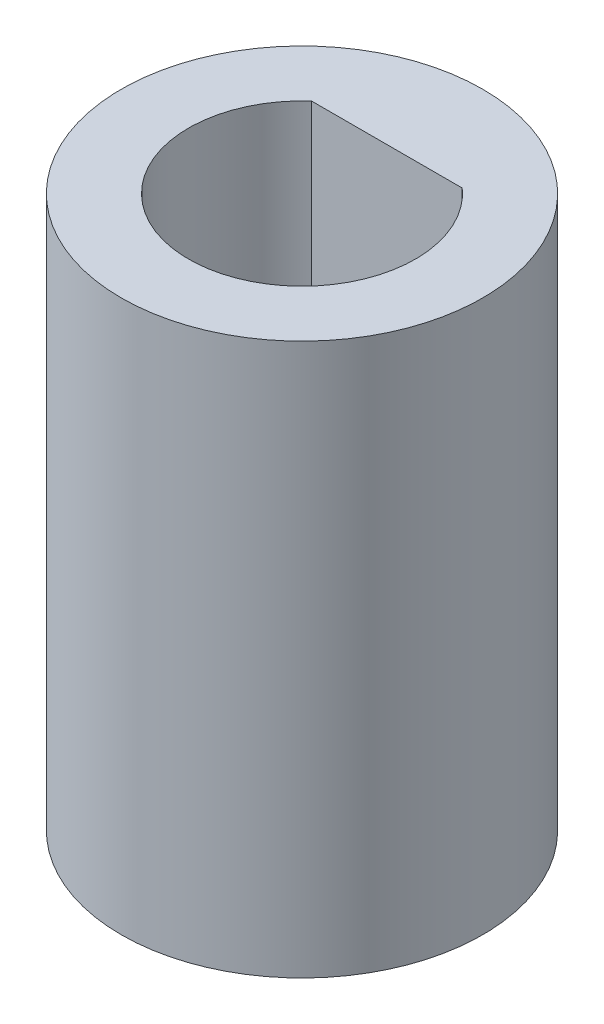
ISO-10303-21;
HEADER;
FILE_DESCRIPTION(('STEP AP214'),'2;1');
FILE_NAME('part.step','',(''),(''),'','','');
FILE_SCHEMA(('AUTOMOTIVE_DESIGN { 1 0 10303 214 1 1 1 1 }'));
ENDSEC;
DATA;
#1=APPLICATION_CONTEXT('core data for automotive mechanical design processes');
#2=APPLICATION_PROTOCOL_DEFINITION('international standard','automotive_design',2000,#1);
#3=PRODUCT_CONTEXT('',#1,'mechanical');
#4=PRODUCT('Part','Part','',(#3));
#5=PRODUCT_RELATED_PRODUCT_CATEGORY('part','',(#4));
#6=PRODUCT_DEFINITION_FORMATION('','',#4);
#7=PRODUCT_DEFINITION_CONTEXT('part definition',#1,'design');
#8=PRODUCT_DEFINITION('design','',#6,#7);
#9=PRODUCT_DEFINITION_SHAPE('','',#8);
#10=(LENGTH_UNIT() NAMED_UNIT(*) SI_UNIT(.MILLI.,.METRE.));
#11=(NAMED_UNIT(*) PLANE_ANGLE_UNIT() SI_UNIT($,.RADIAN.));
#12=(NAMED_UNIT(*) SI_UNIT($,.STERADIAN.) SOLID_ANGLE_UNIT());
#13=UNCERTAINTY_MEASURE_WITH_UNIT(LENGTH_MEASURE(1.E-05),#10,'distance_accuracy_value','');
#14=(GEOMETRIC_REPRESENTATION_CONTEXT(3) GLOBAL_UNCERTAINTY_ASSIGNED_CONTEXT((#13)) GLOBAL_UNIT_ASSIGNED_CONTEXT((#10,
#11,#12)) REPRESENTATION_CONTEXT('',''));
#15=CARTESIAN_POINT('',(0.,0.,0.));
#16=DIRECTION('',(0.,0.,1.));
#17=DIRECTION('',(1.,0.,0.));
#18=AXIS2_PLACEMENT_3D('',#15,#16,#17);
#19=CARTESIAN_POINT('',(0.,-16.4,0.));
#20=DIRECTION('',(0.,1.,0.));
#21=DIRECTION('',(0.,0.,1.));
#22=AXIS2_PLACEMENT_3D('',#19,#20,#21);
#23=CYLINDRICAL_SURFACE('',#22,5.375);
#24=CARTESIAN_POINT('',(0.,-16.4,0.));
#25=DIRECTION('',(0.,1.,0.));
#26=DIRECTION('',(0.,0.,1.));
#27=AXIS2_PLACEMENT_3D('',#24,#25,#26);
#28=CIRCLE('',#27,5.375);
#29=CARTESIAN_POINT('',(0.,-16.4,5.375));
#30=VERTEX_POINT('',#29);
#31=EDGE_CURVE('E11',#30,#30,#28,.T.);
#32=ORIENTED_EDGE('',*,*,#31,.T.);
#33=EDGE_LOOP('',(#32));
#34=FACE_BOUND('',#33,.T.);
#35=CARTESIAN_POINT('',(0.,0.,0.));
#36=DIRECTION('',(0.,1.,0.));
#37=DIRECTION('',(0.,0.,1.));
#38=AXIS2_PLACEMENT_3D('',#35,#36,#37);
#39=CIRCLE('',#38,5.375);
#40=CARTESIAN_POINT('',(0.,0.,5.375));
#41=VERTEX_POINT('',#40);
#42=EDGE_CURVE('E36',#41,#41,#39,.T.);
#43=ORIENTED_EDGE('',*,*,#42,.F.);
#44=EDGE_LOOP('',(#43));
#45=FACE_BOUND('',#44,.T.);
#46=ADVANCED_FACE('F33',(#34,#45),#23,.T.);
#47=CARTESIAN_POINT('',(0.,-16.4,0.));
#48=DIRECTION('',(0.,1.,0.));
#49=DIRECTION('',(0.,0.,1.));
#50=AXIS2_PLACEMENT_3D('',#47,#48,#49);
#51=PLANE('',#50);
#52=DIRECTION('',(-1.,0.,0.));
#53=VECTOR('',#52,1.);
#54=CARTESIAN_POINT('',(-2.23941956765587,-16.4,-2.525));
#55=LINE('',#54,#53);
#56=CARTESIAN_POINT('',(2.23941956765587,-16.4,-2.525));
#57=VERTEX_POINT('',#56);
#58=CARTESIAN_POINT('',(-2.23941956765587,-16.4,-2.525));
#59=VERTEX_POINT('',#58);
#60=EDGE_CURVE('E74',#57,#59,#55,.T.);
#61=ORIENTED_EDGE('',*,*,#60,.T.);
#62=CARTESIAN_POINT('',(0.,-16.4,0.));
#63=DIRECTION('',(0.,1.,0.));
#64=DIRECTION('',(0.,0.,1.));
#65=AXIS2_PLACEMENT_3D('',#62,#63,#64);
#66=CIRCLE('',#65,3.375);
#67=EDGE_CURVE('E47',#59,#57,#66,.T.);
#68=ORIENTED_EDGE('',*,*,#67,.T.);
#69=EDGE_LOOP('',(#61,#68));
#70=FACE_BOUND('',#69,.T.);
#71=ORIENTED_EDGE('',*,*,#31,.F.);
#72=EDGE_LOOP('',(#71));
#73=FACE_BOUND('',#72,.T.);
#74=ADVANCED_FACE('F78',(#70,#73),#51,.F.);
#75=CARTESIAN_POINT('',(0.,0.,0.));
#76=DIRECTION('',(0.,1.,0.));
#77=DIRECTION('',(0.,0.,1.));
#78=AXIS2_PLACEMENT_3D('',#75,#76,#77);
#79=PLANE('',#78);
#80=CARTESIAN_POINT('',(0.,0.,0.));
#81=DIRECTION('',(0.,1.,0.));
#82=DIRECTION('',(0.,0.,1.));
#83=AXIS2_PLACEMENT_3D('',#80,#81,#82);
#84=CIRCLE('',#83,3.375);
#85=CARTESIAN_POINT('',(-2.23941956765587,0.,-2.525));
#86=VERTEX_POINT('',#85);
#87=CARTESIAN_POINT('',(2.23941956765587,0.,-2.525));
#88=VERTEX_POINT('',#87);
#89=EDGE_CURVE('E52',#86,#88,#84,.T.);
#90=ORIENTED_EDGE('',*,*,#89,.F.);
#91=DIRECTION('',(-1.,0.,0.));
#92=VECTOR('',#91,1.);
#93=CARTESIAN_POINT('',(-2.23941956765587,0.,-2.525));
#94=LINE('',#93,#92);
#95=EDGE_CURVE('E66',#88,#86,#94,.T.);
#96=ORIENTED_EDGE('',*,*,#95,.F.);
#97=EDGE_LOOP('',(#90,#96));
#98=FACE_BOUND('',#97,.T.);
#99=ORIENTED_EDGE('',*,*,#42,.T.);
#100=EDGE_LOOP('',(#99));
#101=FACE_BOUND('',#100,.T.);
#102=ADVANCED_FACE('F70',(#98,#101),#79,.T.);
#103=CARTESIAN_POINT('',(0.,-16.4,0.));
#104=DIRECTION('',(0.,1.,0.));
#105=DIRECTION('',(0.,0.,1.));
#106=AXIS2_PLACEMENT_3D('',#103,#104,#105);
#107=CYLINDRICAL_SURFACE('',#106,3.375);
#108=ORIENTED_EDGE('',*,*,#89,.T.);
#109=DIRECTION('',(0.,1.,0.));
#110=VECTOR('',#109,1.);
#111=CARTESIAN_POINT('',(2.23941956765587,-16.4,-2.525));
#112=LINE('',#111,#110);
#113=EDGE_CURVE('E63',#57,#88,#112,.T.);
#114=ORIENTED_EDGE('',*,*,#113,.F.);
#115=ORIENTED_EDGE('',*,*,#67,.F.);
#116=DIRECTION('',(0.,1.,0.));
#117=VECTOR('',#116,1.);
#118=CARTESIAN_POINT('',(-2.23941956765587,-16.4,-2.525));
#119=LINE('',#118,#117);
#120=EDGE_CURVE('E57',#59,#86,#119,.T.);
#121=ORIENTED_EDGE('',*,*,#120,.T.);
#122=EDGE_LOOP('',(#108,#114,#115,#121));
#123=FACE_BOUND('',#122,.T.);
#124=ADVANCED_FACE('F59',(#123),#107,.F.);
#125=CARTESIAN_POINT('',(-2.23941956765587,-16.4,-2.525));
#126=DIRECTION('',(0.,0.,-1.));
#127=DIRECTION('',(-1.,0.,0.));
#128=AXIS2_PLACEMENT_3D('',#125,#126,#127);
#129=PLANE('',#128);
#130=ORIENTED_EDGE('',*,*,#95,.T.);
#131=ORIENTED_EDGE('',*,*,#120,.F.);
#132=ORIENTED_EDGE('',*,*,#60,.F.);
#133=ORIENTED_EDGE('',*,*,#113,.T.);
#134=EDGE_LOOP('',(#130,#131,#132,#133));
#135=FACE_BOUND('',#134,.T.);
#136=ADVANCED_FACE('F67',(#135),#129,.F.);
#137=CLOSED_SHELL('',(#46,#74,#102,#124,#136));
#138=MANIFOLD_SOLID_BREP('B2',#137);
#139=ADVANCED_BREP_SHAPE_REPRESENTATION('',(#18,#138),#14);
#140=SHAPE_DEFINITION_REPRESENTATION(#9,#139);
ENDSEC;
END-ISO-10303-21;
